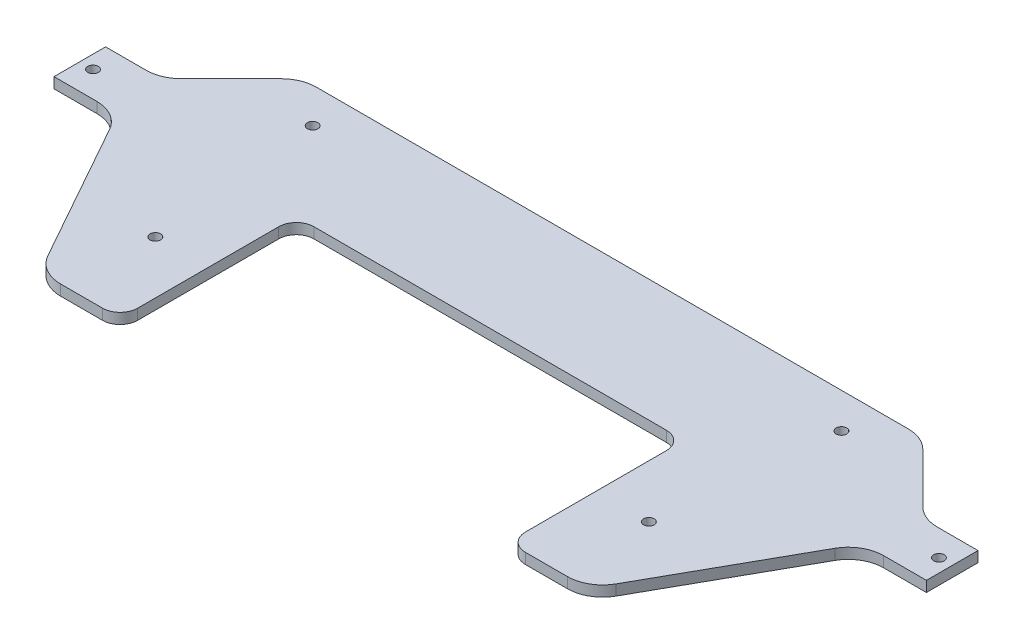
ISO-10303-21;
HEADER;
FILE_DESCRIPTION(('STEP AP214'),'2;1');
FILE_NAME('part.step','',(''),(''),'','','');
FILE_SCHEMA(('AUTOMOTIVE_DESIGN { 1 0 10303 214 1 1 1 1 }'));
ENDSEC;
DATA;
#1=APPLICATION_CONTEXT('core data for automotive mechanical design processes');
#2=APPLICATION_PROTOCOL_DEFINITION('international standard','automotive_design',2000,#1);
#3=PRODUCT_CONTEXT('',#1,'mechanical');
#4=PRODUCT('Part','Part','',(#3));
#5=PRODUCT_RELATED_PRODUCT_CATEGORY('part','',(#4));
#6=PRODUCT_DEFINITION_FORMATION('','',#4);
#7=PRODUCT_DEFINITION_CONTEXT('part definition',#1,'design');
#8=PRODUCT_DEFINITION('design','',#6,#7);
#9=PRODUCT_DEFINITION_SHAPE('','',#8);
#10=(LENGTH_UNIT() NAMED_UNIT(*) SI_UNIT(.MILLI.,.METRE.));
#11=(NAMED_UNIT(*) PLANE_ANGLE_UNIT() SI_UNIT($,.RADIAN.));
#12=(NAMED_UNIT(*) SI_UNIT($,.STERADIAN.) SOLID_ANGLE_UNIT());
#13=UNCERTAINTY_MEASURE_WITH_UNIT(LENGTH_MEASURE(1.E-05),#10,'distance_accuracy_value','');
#14=(GEOMETRIC_REPRESENTATION_CONTEXT(3) GLOBAL_UNCERTAINTY_ASSIGNED_CONTEXT((#13)) GLOBAL_UNIT_ASSIGNED_CONTEXT((#10,
#11,#12)) REPRESENTATION_CONTEXT('',''));
#15=CARTESIAN_POINT('',(0.,0.,0.));
#16=DIRECTION('',(0.,0.,1.));
#17=DIRECTION('',(1.,0.,0.));
#18=AXIS2_PLACEMENT_3D('',#15,#16,#17);
#19=CARTESIAN_POINT('',(-77.75,3.,42.3181711088205));
#20=DIRECTION('',(0.,0.,-1.));
#21=DIRECTION('',(-1.,0.,0.));
#22=AXIS2_PLACEMENT_3D('',#19,#20,#21);
#23=PLANE('',#22);
#24=DIRECTION('',(1.,0.,0.));
#25=VECTOR('',#24,1.);
#26=CARTESIAN_POINT('',(-77.75,0.,42.3181711088205));
#27=LINE('',#26,#25);
#28=CARTESIAN_POINT('',(-71.8887609744845,0.,42.3181711088205));
#29=VERTEX_POINT('',#28);
#30=CARTESIAN_POINT('',(-60.,0.,42.3181711088205));
#31=VERTEX_POINT('',#30);
#32=EDGE_CURVE('E253',#29,#31,#27,.T.);
#33=ORIENTED_EDGE('',*,*,#32,.T.);
#34=DIRECTION('',(0.,1.,0.));
#35=VECTOR('',#34,1.);
#36=CARTESIAN_POINT('',(-60.,3.,42.3181711088205));
#37=LINE('',#36,#35);
#38=CARTESIAN_POINT('',(-60.,3.,42.3181711088205));
#39=VERTEX_POINT('',#38);
#40=EDGE_CURVE('E347',#31,#39,#37,.T.);
#41=ORIENTED_EDGE('',*,*,#40,.T.);
#42=DIRECTION('',(1.,0.,0.));
#43=VECTOR('',#42,1.);
#44=CARTESIAN_POINT('',(-77.75,3.,42.3181711088205));
#45=LINE('',#44,#43);
#46=CARTESIAN_POINT('',(-71.8887609744845,3.,42.3181711088205));
#47=VERTEX_POINT('',#46);
#48=EDGE_CURVE('E460',#47,#39,#45,.T.);
#49=ORIENTED_EDGE('',*,*,#48,.F.);
#50=DIRECTION('',(0.,-1.,0.));
#51=VECTOR('',#50,1.);
#52=CARTESIAN_POINT('',(-71.8887609744845,3.,42.3181711088205));
#53=LINE('',#52,#51);
#54=EDGE_CURVE('E307',#47,#29,#53,.T.);
#55=ORIENTED_EDGE('',*,*,#54,.T.);
#56=EDGE_LOOP('',(#33,#41,#49,#55));
#57=FACE_BOUND('',#56,.T.);
#58=ADVANCED_FACE('F39',(#57),#23,.F.);
#59=CARTESIAN_POINT('',(-88.1,3.,-42.3181711088205));
#60=DIRECTION('',(0.707106781186547,0.,0.707106781186547));
#61=DIRECTION('',(0.707106781186548,0.,-0.707106781186548));
#62=AXIS2_PLACEMENT_3D('',#59,#60,#61);
#63=PLANE('',#62);
#64=DIRECTION('',(-0.707106781186548,0.,0.707106781186548));
#65=VECTOR('',#64,1.);
#66=CARTESIAN_POINT('',(-88.1,3.,-42.3181711088205));
#67=LINE('',#66,#65);
#68=CARTESIAN_POINT('',(-91.0289321881345,3.,-39.389238920686));
#69=VERTEX_POINT('',#68);
#70=CARTESIAN_POINT('',(-105.171067811865,3.,-25.247103296955));
#71=VERTEX_POINT('',#70);
#72=EDGE_CURVE('E270',#69,#71,#67,.T.);
#73=ORIENTED_EDGE('',*,*,#72,.F.);
#74=DIRECTION('',(0.,-1.,0.));
#75=VECTOR('',#74,1.);
#76=CARTESIAN_POINT('',(-91.0289321881345,3.,-39.389238920686));
#77=LINE('',#76,#75);
#78=CARTESIAN_POINT('',(-91.0289321881345,0.,-39.389238920686));
#79=VERTEX_POINT('',#78);
#80=EDGE_CURVE('E301',#69,#79,#77,.T.);
#81=ORIENTED_EDGE('',*,*,#80,.T.);
#82=DIRECTION('',(-0.707106781186548,0.,0.707106781186548));
#83=VECTOR('',#82,1.);
#84=CARTESIAN_POINT('',(-88.1,0.,-42.3181711088205));
#85=LINE('',#84,#83);
#86=CARTESIAN_POINT('',(-105.171067811865,0.,-25.247103296955));
#87=VERTEX_POINT('',#86);
#88=EDGE_CURVE('E249',#79,#87,#85,.T.);
#89=ORIENTED_EDGE('',*,*,#88,.T.);
#90=DIRECTION('',(0.,-1.,0.));
#91=VECTOR('',#90,1.);
#92=CARTESIAN_POINT('',(-105.171067811865,3.,-25.247103296955));
#93=LINE('',#92,#91);
#94=EDGE_CURVE('E299',#87,#71,#93,.F.);
#95=ORIENTED_EDGE('',*,*,#94,.T.);
#96=EDGE_LOOP('',(#73,#81,#89,#95));
#97=FACE_BOUND('',#96,.T.);
#98=ADVANCED_FACE('F480',(#97),#63,.F.);
#99=CARTESIAN_POINT('',(-108.1,3.,-22.3181711088205));
#100=DIRECTION('',(0.,0.,1.));
#101=DIRECTION('',(1.,0.,0.));
#102=AXIS2_PLACEMENT_3D('',#99,#100,#101);
#103=PLANE('',#102);
#104=DIRECTION('',(-1.,0.,0.));
#105=VECTOR('',#104,1.);
#106=CARTESIAN_POINT('',(-108.1,0.,-22.3181711088205));
#107=LINE('',#106,#105);
#108=CARTESIAN_POINT('',(-112.242135623731,0.,-22.3181711088205));
#109=VERTEX_POINT('',#108);
#110=CARTESIAN_POINT('',(-123.75,0.,-22.3181711088205));
#111=VERTEX_POINT('',#110);
#112=EDGE_CURVE('E244',#109,#111,#107,.T.);
#113=ORIENTED_EDGE('',*,*,#112,.T.);
#114=DIRECTION('',(0.,1.,0.));
#115=VECTOR('',#114,1.);
#116=CARTESIAN_POINT('',(-123.75,0.,-22.3181711088205));
#117=LINE('',#116,#115);
#118=CARTESIAN_POINT('',(-123.75,3.,-22.3181711088205));
#119=VERTEX_POINT('',#118);
#120=EDGE_CURVE('E62',#111,#119,#117,.T.);
#121=ORIENTED_EDGE('',*,*,#120,.T.);
#122=DIRECTION('',(-1.,0.,0.));
#123=VECTOR('',#122,1.);
#124=CARTESIAN_POINT('',(-108.1,3.,-22.3181711088205));
#125=LINE('',#124,#123);
#126=CARTESIAN_POINT('',(-112.242135623731,3.,-22.3181711088205));
#127=VERTEX_POINT('',#126);
#128=EDGE_CURVE('E452',#127,#119,#125,.T.);
#129=ORIENTED_EDGE('',*,*,#128,.F.);
#130=DIRECTION('',(0.,-1.,0.));
#131=VECTOR('',#130,1.);
#132=CARTESIAN_POINT('',(-112.242135623731,0.,-22.3181711088205));
#133=LINE('',#132,#131);
#134=EDGE_CURVE('E328',#127,#109,#133,.T.);
#135=ORIENTED_EDGE('',*,*,#134,.T.);
#136=EDGE_LOOP('',(#113,#121,#129,#135));
#137=FACE_BOUND('',#136,.T.);
#138=ADVANCED_FACE('F488',(#137),#103,.F.);
#139=CARTESIAN_POINT('',(-127.75,3.,-7.6818288911795));
#140=DIRECTION('',(0.,0.,-1.));
#141=DIRECTION('',(-1.,0.,0.));
#142=AXIS2_PLACEMENT_3D('',#139,#140,#141);
#143=PLANE('',#142);
#144=DIRECTION('',(1.,0.,0.));
#145=VECTOR('',#144,1.);
#146=CARTESIAN_POINT('',(-127.75,3.,-7.6818288911795));
#147=LINE('',#146,#145);
#148=CARTESIAN_POINT('',(-123.75,3.,-7.6818288911795));
#149=VERTEX_POINT('',#148);
#150=CARTESIAN_POINT('',(-111.611239025516,3.,-7.6818288911795));
#151=VERTEX_POINT('',#150);
#152=EDGE_CURVE('E237',#149,#151,#147,.T.);
#153=ORIENTED_EDGE('',*,*,#152,.F.);
#154=DIRECTION('',(0.,1.,0.));
#155=VECTOR('',#154,1.);
#156=CARTESIAN_POINT('',(-123.75,0.,-7.6818288911795));
#157=LINE('',#156,#155);
#158=CARTESIAN_POINT('',(-123.75,0.,-7.6818288911795));
#159=VERTEX_POINT('',#158);
#160=EDGE_CURVE('E223',#159,#149,#157,.T.);
#161=ORIENTED_EDGE('',*,*,#160,.F.);
#162=DIRECTION('',(1.,0.,0.));
#163=VECTOR('',#162,1.);
#164=CARTESIAN_POINT('',(-127.75,0.,-7.6818288911795));
#165=LINE('',#164,#163);
#166=CARTESIAN_POINT('',(-111.611239025516,0.,-7.6818288911795));
#167=VERTEX_POINT('',#166);
#168=EDGE_CURVE('E235',#159,#167,#165,.T.);
#169=ORIENTED_EDGE('',*,*,#168,.T.);
#170=DIRECTION('',(0.,-1.,0.));
#171=VECTOR('',#170,1.);
#172=CARTESIAN_POINT('',(-111.611239025516,3.,-7.6818288911795));
#173=LINE('',#172,#171);
#174=EDGE_CURVE('E326',#167,#151,#173,.F.);
#175=ORIENTED_EDGE('',*,*,#174,.T.);
#176=EDGE_LOOP('',(#153,#161,#169,#175));
#177=FACE_BOUND('',#176,.T.);
#178=ADVANCED_FACE('F233',(#177),#143,.F.);
#179=CARTESIAN_POINT('',(-105.75,3.,-7.6818288911795));
#180=DIRECTION('',(0.87250601594972,0.,-0.488603368931844));
#181=DIRECTION('',(-0.488603368931844,0.,-0.87250601594972));
#182=AXIS2_PLACEMENT_3D('',#179,#180,#181);
#183=PLANE('',#182);
#184=DIRECTION('',(0.488603368931844,0.,0.87250601594972));
#185=VECTOR('',#184,1.);
#186=CARTESIAN_POINT('',(-105.75,0.,-7.6818288911795));
#187=LINE('',#186,#185);
#188=CARTESIAN_POINT('',(-102.886178866018,0.,-2.56786258049794));
#189=VERTEX_POINT('',#188);
#190=CARTESIAN_POINT('',(-80.6138211339817,0.,37.2042047981389));
#191=VERTEX_POINT('',#190);
#192=EDGE_CURVE('E243',#189,#191,#187,.T.);
#193=ORIENTED_EDGE('',*,*,#192,.T.);
#194=DIRECTION('',(0.,-1.,0.));
#195=VECTOR('',#194,1.);
#196=CARTESIAN_POINT('',(-80.6138211339817,3.,37.2042047981389));
#197=LINE('',#196,#195);
#198=CARTESIAN_POINT('',(-80.6138211339817,3.,37.2042047981389));
#199=VERTEX_POINT('',#198);
#200=EDGE_CURVE('E313',#191,#199,#197,.F.);
#201=ORIENTED_EDGE('',*,*,#200,.T.);
#202=DIRECTION('',(0.488603368931844,0.,0.87250601594972));
#203=VECTOR('',#202,1.);
#204=CARTESIAN_POINT('',(-105.75,3.,-7.6818288911795));
#205=LINE('',#204,#203);
#206=CARTESIAN_POINT('',(-102.886178866018,3.,-2.56786258049794));
#207=VERTEX_POINT('',#206);
#208=EDGE_CURVE('E456',#207,#199,#205,.T.);
#209=ORIENTED_EDGE('',*,*,#208,.F.);
#210=DIRECTION('',(0.,-1.,0.));
#211=VECTOR('',#210,1.);
#212=CARTESIAN_POINT('',(-102.886178866018,0.,-2.56786258049794));
#213=LINE('',#212,#211);
#214=EDGE_CURVE('E310',#207,#189,#213,.T.);
#215=ORIENTED_EDGE('',*,*,#214,.T.);
#216=EDGE_LOOP('',(#193,#201,#209,#215));
#217=FACE_BOUND('',#216,.T.);
#218=ADVANCED_FACE('F584',(#217),#183,.F.);
#219=CARTESIAN_POINT('',(60.,3.,42.3181711088205));
#220=VERTEX_POINT('',#219);
#221=CARTESIAN_POINT('',(71.8887609744845,3.,42.3181711088205));
#222=VERTEX_POINT('',#221);
#223=EDGE_CURVE('E459',#220,#222,#45,.T.);
#224=ORIENTED_EDGE('',*,*,#223,.F.);
#225=DIRECTION('',(0.,1.,0.));
#226=VECTOR('',#225,1.);
#227=CARTESIAN_POINT('',(60.,3.,42.3181711088205));
#228=LINE('',#227,#226);
#229=CARTESIAN_POINT('',(60.,0.,42.3181711088205));
#230=VERTEX_POINT('',#229);
#231=EDGE_CURVE('E368',#220,#230,#228,.F.);
#232=ORIENTED_EDGE('',*,*,#231,.T.);
#233=CARTESIAN_POINT('',(71.8887609744845,0.,42.3181711088205));
#234=VERTEX_POINT('',#233);
#235=EDGE_CURVE('E247',#230,#234,#27,.T.);
#236=ORIENTED_EDGE('',*,*,#235,.T.);
#237=DIRECTION('',(0.,-1.,0.));
#238=VECTOR('',#237,1.);
#239=CARTESIAN_POINT('',(71.8887609744845,3.,42.3181711088205));
#240=LINE('',#239,#238);
#241=EDGE_CURVE('E304',#234,#222,#240,.F.);
#242=ORIENTED_EDGE('',*,*,#241,.T.);
#243=EDGE_LOOP('',(#224,#232,#236,#242));
#244=FACE_BOUND('',#243,.T.);
#245=ADVANCED_FACE('F515',(#244),#23,.F.);
#246=CARTESIAN_POINT('',(105.75,3.,-7.6818288911795));
#247=DIRECTION('',(-0.87250601594972,0.,-0.488603368931844));
#248=DIRECTION('',(-0.488603368931844,0.,0.87250601594972));
#249=AXIS2_PLACEMENT_3D('',#246,#247,#248);
#250=PLANE('',#249);
#251=DIRECTION('',(0.488603368931844,0.,-0.87250601594972));
#252=VECTOR('',#251,1.);
#253=CARTESIAN_POINT('',(105.75,3.,-7.6818288911795));
#254=LINE('',#253,#252);
#255=CARTESIAN_POINT('',(80.6138211339817,3.,37.2042047981389));
#256=VERTEX_POINT('',#255);
#257=CARTESIAN_POINT('',(102.886178866018,3.,-2.56786258049794));
#258=VERTEX_POINT('',#257);
#259=EDGE_CURVE('E463',#256,#258,#254,.T.);
#260=ORIENTED_EDGE('',*,*,#259,.F.);
#261=DIRECTION('',(0.,-1.,0.));
#262=VECTOR('',#261,1.);
#263=CARTESIAN_POINT('',(80.6138211339817,3.,37.2042047981389));
#264=LINE('',#263,#262);
#265=CARTESIAN_POINT('',(80.6138211339817,0.,37.2042047981389));
#266=VERTEX_POINT('',#265);
#267=EDGE_CURVE('E317',#256,#266,#264,.T.);
#268=ORIENTED_EDGE('',*,*,#267,.T.);
#269=DIRECTION('',(0.488603368931844,0.,-0.87250601594972));
#270=VECTOR('',#269,1.);
#271=CARTESIAN_POINT('',(105.75,0.,-7.6818288911795));
#272=LINE('',#271,#270);
#273=CARTESIAN_POINT('',(102.886178866018,0.,-2.56786258049794));
#274=VERTEX_POINT('',#273);
#275=EDGE_CURVE('E256',#266,#274,#272,.T.);
#276=ORIENTED_EDGE('',*,*,#275,.T.);
#277=DIRECTION('',(0.,-1.,0.));
#278=VECTOR('',#277,1.);
#279=CARTESIAN_POINT('',(102.886178866018,3.,-2.56786258049794));
#280=LINE('',#279,#278);
#281=EDGE_CURVE('E315',#274,#258,#280,.F.);
#282=ORIENTED_EDGE('',*,*,#281,.T.);
#283=EDGE_LOOP('',(#260,#268,#276,#282));
#284=FACE_BOUND('',#283,.T.);
#285=ADVANCED_FACE('F524',(#284),#250,.F.);
#286=CARTESIAN_POINT('',(127.75,3.,-7.6818288911795));
#287=DIRECTION('',(0.,0.,-1.));
#288=DIRECTION('',(-1.,0.,0.));
#289=AXIS2_PLACEMENT_3D('',#286,#287,#288);
#290=PLANE('',#289);
#291=DIRECTION('',(1.,0.,0.));
#292=VECTOR('',#291,1.);
#293=CARTESIAN_POINT('',(127.75,0.,-7.6818288911795));
#294=LINE('',#293,#292);
#295=CARTESIAN_POINT('',(111.611239025516,0.,-7.6818288911795));
#296=VERTEX_POINT('',#295);
#297=CARTESIAN_POINT('',(123.75,0.,-7.6818288911795));
#298=VERTEX_POINT('',#297);
#299=EDGE_CURVE('E259',#296,#298,#294,.T.);
#300=ORIENTED_EDGE('',*,*,#299,.T.);
#301=DIRECTION('',(0.,1.,0.));
#302=VECTOR('',#301,1.);
#303=CARTESIAN_POINT('',(123.75,0.,-7.6818288911795));
#304=LINE('',#303,#302);
#305=CARTESIAN_POINT('',(123.75,3.,-7.6818288911795));
#306=VERTEX_POINT('',#305);
#307=EDGE_CURVE('E54',#298,#306,#304,.T.);
#308=ORIENTED_EDGE('',*,*,#307,.T.);
#309=DIRECTION('',(1.,0.,0.));
#310=VECTOR('',#309,1.);
#311=CARTESIAN_POINT('',(127.75,3.,-7.6818288911795));
#312=LINE('',#311,#310);
#313=CARTESIAN_POINT('',(111.611239025516,3.,-7.6818288911795));
#314=VERTEX_POINT('',#313);
#315=EDGE_CURVE('E466',#314,#306,#312,.T.);
#316=ORIENTED_EDGE('',*,*,#315,.F.);
#317=DIRECTION('',(0.,-1.,0.));
#318=VECTOR('',#317,1.);
#319=CARTESIAN_POINT('',(111.611239025516,0.,-7.6818288911795));
#320=LINE('',#319,#318);
#321=EDGE_CURVE('E323',#314,#296,#320,.T.);
#322=ORIENTED_EDGE('',*,*,#321,.T.);
#323=EDGE_LOOP('',(#300,#308,#316,#322));
#324=FACE_BOUND('',#323,.T.);
#325=ADVANCED_FACE('F533',(#324),#290,.F.);
#326=CARTESIAN_POINT('',(108.1,3.,-22.3181711088205));
#327=DIRECTION('',(0.,0.,1.));
#328=DIRECTION('',(1.,0.,0.));
#329=AXIS2_PLACEMENT_3D('',#326,#327,#328);
#330=PLANE('',#329);
#331=DIRECTION('',(-1.,0.,0.));
#332=VECTOR('',#331,1.);
#333=CARTESIAN_POINT('',(108.1,3.,-22.3181711088205));
#334=LINE('',#333,#332);
#335=CARTESIAN_POINT('',(123.75,3.,-22.3181711088205));
#336=VERTEX_POINT('',#335);
#337=CARTESIAN_POINT('',(112.242135623731,3.,-22.3181711088205));
#338=VERTEX_POINT('',#337);
#339=EDGE_CURVE('E469',#336,#338,#334,.T.);
#340=ORIENTED_EDGE('',*,*,#339,.F.);
#341=DIRECTION('',(0.,1.,0.));
#342=VECTOR('',#341,1.);
#343=CARTESIAN_POINT('',(123.75,0.,-22.3181711088205));
#344=LINE('',#343,#342);
#345=CARTESIAN_POINT('',(123.75,0.,-22.3181711088205));
#346=VERTEX_POINT('',#345);
#347=EDGE_CURVE('E492',#346,#336,#344,.T.);
#348=ORIENTED_EDGE('',*,*,#347,.F.);
#349=DIRECTION('',(-1.,0.,0.));
#350=VECTOR('',#349,1.);
#351=CARTESIAN_POINT('',(108.1,0.,-22.3181711088205));
#352=LINE('',#351,#350);
#353=CARTESIAN_POINT('',(112.242135623731,0.,-22.3181711088205));
#354=VERTEX_POINT('',#353);
#355=EDGE_CURVE('E262',#346,#354,#352,.T.);
#356=ORIENTED_EDGE('',*,*,#355,.T.);
#357=DIRECTION('',(0.,-1.,0.));
#358=VECTOR('',#357,1.);
#359=CARTESIAN_POINT('',(112.242135623731,3.,-22.3181711088205));
#360=LINE('',#359,#358);
#361=EDGE_CURVE('E320',#354,#338,#360,.F.);
#362=ORIENTED_EDGE('',*,*,#361,.T.);
#363=EDGE_LOOP('',(#340,#348,#356,#362));
#364=FACE_BOUND('',#363,.T.);
#365=ADVANCED_FACE('F540',(#364),#330,.F.);
#366=CARTESIAN_POINT('',(88.1,3.,-42.3181711088205));
#367=DIRECTION('',(-0.707106781186547,0.,0.707106781186547));
#368=DIRECTION('',(0.707106781186548,0.,0.707106781186548));
#369=AXIS2_PLACEMENT_3D('',#366,#367,#368);
#370=PLANE('',#369);
#371=DIRECTION('',(-0.707106781186548,0.,-0.707106781186548));
#372=VECTOR('',#371,1.);
#373=CARTESIAN_POINT('',(88.1,0.,-42.3181711088205));
#374=LINE('',#373,#372);
#375=CARTESIAN_POINT('',(105.171067811865,0.,-25.247103296955));
#376=VERTEX_POINT('',#375);
#377=CARTESIAN_POINT('',(91.0289321881345,0.,-39.389238920686));
#378=VERTEX_POINT('',#377);
#379=EDGE_CURVE('E264',#376,#378,#374,.T.);
#380=ORIENTED_EDGE('',*,*,#379,.T.);
#381=DIRECTION('',(0.,-1.,0.));
#382=VECTOR('',#381,1.);
#383=CARTESIAN_POINT('',(91.0289321881345,3.,-39.389238920686));
#384=LINE('',#383,#382);
#385=CARTESIAN_POINT('',(91.0289321881345,3.,-39.389238920686));
#386=VERTEX_POINT('',#385);
#387=EDGE_CURVE('E289',#378,#386,#384,.F.);
#388=ORIENTED_EDGE('',*,*,#387,.T.);
#389=DIRECTION('',(-0.707106781186548,0.,-0.707106781186548));
#390=VECTOR('',#389,1.);
#391=CARTESIAN_POINT('',(88.1,3.,-42.3181711088205));
#392=LINE('',#391,#390);
#393=CARTESIAN_POINT('',(105.171067811865,3.,-25.247103296955));
#394=VERTEX_POINT('',#393);
#395=EDGE_CURVE('E471',#394,#386,#392,.T.);
#396=ORIENTED_EDGE('',*,*,#395,.F.);
#397=DIRECTION('',(0.,-1.,0.));
#398=VECTOR('',#397,1.);
#399=CARTESIAN_POINT('',(105.171067811865,0.,-25.247103296955));
#400=LINE('',#399,#398);
#401=EDGE_CURVE('E286',#394,#376,#400,.T.);
#402=ORIENTED_EDGE('',*,*,#401,.T.);
#403=EDGE_LOOP('',(#380,#388,#396,#402));
#404=FACE_BOUND('',#403,.T.);
#405=ADVANCED_FACE('F548',(#404),#370,.F.);
#406=CARTESIAN_POINT('',(-88.1,3.,-42.3181711088205));
#407=DIRECTION('',(0.,0.,1.));
#408=DIRECTION('',(1.,0.,0.));
#409=AXIS2_PLACEMENT_3D('',#406,#407,#408);
#410=PLANE('',#409);
#411=DIRECTION('',(-1.,0.,0.));
#412=VECTOR('',#411,1.);
#413=CARTESIAN_POINT('',(-88.1,3.,-42.3181711088205));
#414=LINE('',#413,#412);
#415=CARTESIAN_POINT('',(83.9578643762691,3.,-42.3181711088205));
#416=VERTEX_POINT('',#415);
#417=CARTESIAN_POINT('',(-83.9578643762691,3.,-42.3181711088205));
#418=VERTEX_POINT('',#417);
#419=EDGE_CURVE('E274',#416,#418,#414,.T.);
#420=ORIENTED_EDGE('',*,*,#419,.F.);
#421=DIRECTION('',(0.,-1.,0.));
#422=VECTOR('',#421,1.);
#423=CARTESIAN_POINT('',(83.9578643762691,3.,-42.3181711088205));
#424=LINE('',#423,#422);
#425=CARTESIAN_POINT('',(83.9578643762691,0.,-42.3181711088205));
#426=VERTEX_POINT('',#425);
#427=EDGE_CURVE('E273',#416,#426,#424,.T.);
#428=ORIENTED_EDGE('',*,*,#427,.T.);
#429=DIRECTION('',(-1.,0.,0.));
#430=VECTOR('',#429,1.);
#431=CARTESIAN_POINT('',(-88.1,0.,-42.3181711088205));
#432=LINE('',#431,#430);
#433=CARTESIAN_POINT('',(-83.9578643762691,0.,-42.3181711088205));
#434=VERTEX_POINT('',#433);
#435=EDGE_CURVE('E267',#426,#434,#432,.T.);
#436=ORIENTED_EDGE('',*,*,#435,.T.);
#437=DIRECTION('',(0.,-1.,0.));
#438=VECTOR('',#437,1.);
#439=CARTESIAN_POINT('',(-83.9578643762691,3.,-42.3181711088205));
#440=LINE('',#439,#438);
#441=EDGE_CURVE('E271',#434,#418,#440,.F.);
#442=ORIENTED_EDGE('',*,*,#441,.T.);
#443=EDGE_LOOP('',(#420,#428,#436,#442));
#444=FACE_BOUND('',#443,.T.);
#445=ADVANCED_FACE('F559',(#444),#410,.F.);
#446=CARTESIAN_POINT('',(0.,3.,0.));
#447=DIRECTION('',(0.,1.,0.));
#448=DIRECTION('',(0.,0.,1.));
#449=AXIS2_PLACEMENT_3D('',#446,#447,#448);
#450=PLANE('',#449);
#451=DIRECTION('',(0.,0.,-1.));
#452=VECTOR('',#451,1.);
#453=CARTESIAN_POINT('',(-123.75,3.,-7.6818288911795));
#454=LINE('',#453,#452);
#455=EDGE_CURVE('E229',#149,#119,#454,.T.);
#456=ORIENTED_EDGE('',*,*,#455,.F.);
#457=ORIENTED_EDGE('',*,*,#152,.T.);
#458=CARTESIAN_POINT('',(-111.611239025516,3.,2.3181711088205));
#459=DIRECTION('',(0.,1.,0.));
#460=DIRECTION('',(0.,0.,1.));
#461=AXIS2_PLACEMENT_3D('',#458,#459,#460);
#462=CIRCLE('',#461,10.);
#463=EDGE_CURVE('E341',#151,#207,#462,.F.);
#464=ORIENTED_EDGE('',*,*,#463,.T.);
#465=ORIENTED_EDGE('',*,*,#208,.T.);
#466=CARTESIAN_POINT('',(-71.8887609744845,3.,32.3181711088205));
#467=DIRECTION('',(0.,1.,0.));
#468=DIRECTION('',(0.,0.,1.));
#469=AXIS2_PLACEMENT_3D('',#466,#467,#468);
#470=CIRCLE('',#469,10.);
#471=EDGE_CURVE('E293',#199,#47,#470,.T.);
#472=ORIENTED_EDGE('',*,*,#471,.T.);
#473=ORIENTED_EDGE('',*,*,#48,.T.);
#474=CARTESIAN_POINT('',(-60.,3.,37.3181711088205));
#475=DIRECTION('',(0.,1.,0.));
#476=DIRECTION('',(0.,0.,1.));
#477=AXIS2_PLACEMENT_3D('',#474,#475,#476);
#478=CIRCLE('',#477,5.);
#479=CARTESIAN_POINT('',(-55.,3.,37.3181711088205));
#480=VERTEX_POINT('',#479);
#481=EDGE_CURVE('E352',#39,#480,#478,.T.);
#482=ORIENTED_EDGE('',*,*,#481,.T.);
#483=DIRECTION('',(0.,0.,1.));
#484=VECTOR('',#483,1.);
#485=CARTESIAN_POINT('',(-55.,3.,42.3181711088205));
#486=LINE('',#485,#484);
#487=CARTESIAN_POINT('',(-55.,3.,-2.68182889117948));
#488=VERTEX_POINT('',#487);
#489=EDGE_CURVE('E386',#488,#480,#486,.T.);
#490=ORIENTED_EDGE('',*,*,#489,.F.);
#491=CARTESIAN_POINT('',(-50.,3.,-2.68182889117948));
#492=DIRECTION('',(0.,1.,0.));
#493=DIRECTION('',(0.,0.,1.));
#494=AXIS2_PLACEMENT_3D('',#491,#492,#493);
#495=CIRCLE('',#494,5.);
#496=CARTESIAN_POINT('',(-50.,3.,-7.68182889117949));
#497=VERTEX_POINT('',#496);
#498=EDGE_CURVE('E47',#488,#497,#495,.F.);
#499=ORIENTED_EDGE('',*,*,#498,.T.);
#500=DIRECTION('',(-1.,0.,0.));
#501=VECTOR('',#500,1.);
#502=CARTESIAN_POINT('',(-55.,3.,-7.68182889117949));
#503=LINE('',#502,#501);
#504=CARTESIAN_POINT('',(50.,3.,-7.68182889117949));
#505=VERTEX_POINT('',#504);
#506=EDGE_CURVE('E384',#505,#497,#503,.T.);
#507=ORIENTED_EDGE('',*,*,#506,.F.);
#508=CARTESIAN_POINT('',(50.,3.,-2.68182889117949));
#509=DIRECTION('',(0.,1.,0.));
#510=DIRECTION('',(0.,0.,1.));
#511=AXIS2_PLACEMENT_3D('',#508,#509,#510);
#512=CIRCLE('',#511,5.);
#513=CARTESIAN_POINT('',(55.,3.,-2.68182889117949));
#514=VERTEX_POINT('',#513);
#515=EDGE_CURVE('E375',#505,#514,#512,.F.);
#516=ORIENTED_EDGE('',*,*,#515,.T.);
#517=DIRECTION('',(0.,0.,-1.));
#518=VECTOR('',#517,1.);
#519=CARTESIAN_POINT('',(55.,3.,-7.68182889117949));
#520=LINE('',#519,#518);
#521=CARTESIAN_POINT('',(55.,3.,37.3181711088205));
#522=VERTEX_POINT('',#521);
#523=EDGE_CURVE('E395',#522,#514,#520,.T.);
#524=ORIENTED_EDGE('',*,*,#523,.F.);
#525=CARTESIAN_POINT('',(60.,3.,37.3181711088205));
#526=DIRECTION('',(0.,1.,0.));
#527=DIRECTION('',(0.,0.,1.));
#528=AXIS2_PLACEMENT_3D('',#525,#526,#527);
#529=CIRCLE('',#528,5.);
#530=EDGE_CURVE('E350',#522,#220,#529,.T.);
#531=ORIENTED_EDGE('',*,*,#530,.T.);
#532=ORIENTED_EDGE('',*,*,#223,.T.);
#533=CARTESIAN_POINT('',(71.8887609744845,3.,32.3181711088205));
#534=DIRECTION('',(0.,1.,0.));
#535=DIRECTION('',(0.,0.,1.));
#536=AXIS2_PLACEMENT_3D('',#533,#534,#535);
#537=CIRCLE('',#536,10.);
#538=EDGE_CURVE('E291',#222,#256,#537,.T.);
#539=ORIENTED_EDGE('',*,*,#538,.T.);
#540=ORIENTED_EDGE('',*,*,#259,.T.);
#541=CARTESIAN_POINT('',(111.611239025516,3.,2.3181711088205));
#542=DIRECTION('',(0.,1.,0.));
#543=DIRECTION('',(0.,0.,1.));
#544=AXIS2_PLACEMENT_3D('',#541,#542,#543);
#545=CIRCLE('',#544,10.);
#546=EDGE_CURVE('E338',#258,#314,#545,.F.);
#547=ORIENTED_EDGE('',*,*,#546,.T.);
#548=ORIENTED_EDGE('',*,*,#315,.T.);
#549=DIRECTION('',(0.,0.,1.));
#550=VECTOR('',#549,1.);
#551=CARTESIAN_POINT('',(123.75,3.,-7.6818288911795));
#552=LINE('',#551,#550);
#553=EDGE_CURVE('E496',#336,#306,#552,.T.);
#554=ORIENTED_EDGE('',*,*,#553,.F.);
#555=ORIENTED_EDGE('',*,*,#339,.T.);
#556=CARTESIAN_POINT('',(112.242135623731,3.,-32.3181711088205));
#557=DIRECTION('',(0.,1.,0.));
#558=DIRECTION('',(0.,0.,1.));
#559=AXIS2_PLACEMENT_3D('',#556,#557,#558);
#560=CIRCLE('',#559,10.);
#561=EDGE_CURVE('E334',#338,#394,#560,.F.);
#562=ORIENTED_EDGE('',*,*,#561,.T.);
#563=ORIENTED_EDGE('',*,*,#395,.T.);
#564=CARTESIAN_POINT('',(83.9578643762691,3.,-32.3181711088205));
#565=DIRECTION('',(0.,1.,0.));
#566=DIRECTION('',(0.,0.,1.));
#567=AXIS2_PLACEMENT_3D('',#564,#565,#566);
#568=CIRCLE('',#567,10.);
#569=EDGE_CURVE('E297',#386,#416,#568,.T.);
#570=ORIENTED_EDGE('',*,*,#569,.T.);
#571=ORIENTED_EDGE('',*,*,#419,.T.);
#572=CARTESIAN_POINT('',(-83.9578643762691,3.,-32.3181711088205));
#573=DIRECTION('',(0.,1.,0.));
#574=DIRECTION('',(0.,0.,1.));
#575=AXIS2_PLACEMENT_3D('',#572,#573,#574);
#576=CIRCLE('',#575,10.);
#577=EDGE_CURVE('E295',#418,#69,#576,.T.);
#578=ORIENTED_EDGE('',*,*,#577,.T.);
#579=ORIENTED_EDGE('',*,*,#72,.T.);
#580=CARTESIAN_POINT('',(-112.242135623731,3.,-32.3181711088205));
#581=DIRECTION('',(0.,1.,0.));
#582=DIRECTION('',(0.,0.,1.));
#583=AXIS2_PLACEMENT_3D('',#580,#581,#582);
#584=CIRCLE('',#583,10.);
#585=EDGE_CURVE('E345',#71,#127,#584,.F.);
#586=ORIENTED_EDGE('',*,*,#585,.T.);
#587=ORIENTED_EDGE('',*,*,#128,.T.);
#588=EDGE_LOOP('',(#456,#457,#464,#465,#472,#473,#482,#490,#499,#507,#516,#524,#531,#532,#539,
#540,#547,#548,#554,#555,#562,#563,#570,#571,#578,#579,#586,#587));
#589=FACE_BOUND('',#588,.T.);
#590=CARTESIAN_POINT('',(75.,3.,-32.3181711088205));
#591=DIRECTION('',(0.,1.,0.));
#592=DIRECTION('',(0.,0.,1.));
#593=AXIS2_PLACEMENT_3D('',#590,#591,#592);
#594=CIRCLE('',#593,1.5);
#595=CARTESIAN_POINT('',(75.,3.,-30.8181711088205));
#596=VERTEX_POINT('',#595);
#597=EDGE_CURVE('E409',#596,#596,#594,.T.);
#598=ORIENTED_EDGE('',*,*,#597,.F.);
#599=EDGE_LOOP('',(#598));
#600=FACE_BOUND('',#599,.T.);
#601=CARTESIAN_POINT('',(-70.,3.,17.3181711088205));
#602=DIRECTION('',(0.,1.,0.));
#603=DIRECTION('',(0.,0.,1.));
#604=AXIS2_PLACEMENT_3D('',#601,#602,#603);
#605=CIRCLE('',#604,1.5);
#606=CARTESIAN_POINT('',(-70.,3.,18.8181711088205));
#607=VERTEX_POINT('',#606);
#608=EDGE_CURVE('E433',#607,#607,#605,.T.);
#609=ORIENTED_EDGE('',*,*,#608,.F.);
#610=EDGE_LOOP('',(#609));
#611=FACE_BOUND('',#610,.T.);
#612=CARTESIAN_POINT('',(-119.996067811865,3.,-15.));
#613=DIRECTION('',(0.,1.,0.));
#614=DIRECTION('',(0.,0.,1.));
#615=AXIS2_PLACEMENT_3D('',#612,#613,#614);
#616=CIRCLE('',#615,1.5);
#617=CARTESIAN_POINT('',(-119.996067811865,3.,-13.5));
#618=VERTEX_POINT('',#617);
#619=EDGE_CURVE('E440',#618,#618,#616,.T.);
#620=ORIENTED_EDGE('',*,*,#619,.F.);
#621=EDGE_LOOP('',(#620));
#622=FACE_BOUND('',#621,.T.);
#623=CARTESIAN_POINT('',(119.996067811865,3.,-15.));
#624=DIRECTION('',(0.,1.,0.));
#625=DIRECTION('',(0.,0.,1.));
#626=AXIS2_PLACEMENT_3D('',#623,#624,#625);
#627=CIRCLE('',#626,1.5);
#628=CARTESIAN_POINT('',(119.996067811865,3.,-13.5));
#629=VERTEX_POINT('',#628);
#630=EDGE_CURVE('E421',#629,#629,#627,.T.);
#631=ORIENTED_EDGE('',*,*,#630,.F.);
#632=EDGE_LOOP('',(#631));
#633=FACE_BOUND('',#632,.T.);
#634=CARTESIAN_POINT('',(-75.,3.,-32.3181711088205));
#635=DIRECTION('',(0.,1.,0.));
#636=DIRECTION('',(0.,0.,1.));
#637=AXIS2_PLACEMENT_3D('',#634,#635,#636);
#638=CIRCLE('',#637,1.5);
#639=CARTESIAN_POINT('',(-75.,3.,-30.8181711088205));
#640=VERTEX_POINT('',#639);
#641=EDGE_CURVE('E428',#640,#640,#638,.T.);
#642=ORIENTED_EDGE('',*,*,#641,.F.);
#643=EDGE_LOOP('',(#642));
#644=FACE_BOUND('',#643,.T.);
#645=CARTESIAN_POINT('',(70.,3.,17.3181711088205));
#646=DIRECTION('',(0.,1.,0.));
#647=DIRECTION('',(0.,0.,1.));
#648=AXIS2_PLACEMENT_3D('',#645,#646,#647);
#649=CIRCLE('',#648,1.5);
#650=CARTESIAN_POINT('',(70.,3.,18.8181711088205));
#651=VERTEX_POINT('',#650);
#652=EDGE_CURVE('E436',#651,#651,#649,.T.);
#653=ORIENTED_EDGE('',*,*,#652,.F.);
#654=EDGE_LOOP('',(#653));
#655=FACE_BOUND('',#654,.T.);
#656=ADVANCED_FACE('F382',(#589,#600,#611,#622,#633,#644,#655),#450,.T.);
#657=CARTESIAN_POINT('',(0.,0.,0.));
#658=DIRECTION('',(0.,1.,0.));
#659=DIRECTION('',(0.,0.,1.));
#660=AXIS2_PLACEMENT_3D('',#657,#658,#659);
#661=PLANE('',#660);
#662=CARTESIAN_POINT('',(75.,0.,-32.3181711088205));
#663=DIRECTION('',(0.,1.,0.));
#664=DIRECTION('',(0.,0.,1.));
#665=AXIS2_PLACEMENT_3D('',#662,#663,#664);
#666=CIRCLE('',#665,1.5);
#667=CARTESIAN_POINT('',(75.,0.,-30.8181711088205));
#668=VERTEX_POINT('',#667);
#669=EDGE_CURVE('E406',#668,#668,#666,.T.);
#670=ORIENTED_EDGE('',*,*,#669,.T.);
#671=EDGE_LOOP('',(#670));
#672=FACE_BOUND('',#671,.T.);
#673=CARTESIAN_POINT('',(-70.,0.,17.3181711088205));
#674=DIRECTION('',(0.,1.,0.));
#675=DIRECTION('',(0.,0.,1.));
#676=AXIS2_PLACEMENT_3D('',#673,#674,#675);
#677=CIRCLE('',#676,1.5);
#678=CARTESIAN_POINT('',(-70.,0.,18.8181711088205));
#679=VERTEX_POINT('',#678);
#680=EDGE_CURVE('E437',#679,#679,#677,.T.);
#681=ORIENTED_EDGE('',*,*,#680,.T.);
#682=EDGE_LOOP('',(#681));
#683=FACE_BOUND('',#682,.T.);
#684=CARTESIAN_POINT('',(-119.996067811865,0.,-15.));
#685=DIRECTION('',(0.,1.,0.));
#686=DIRECTION('',(0.,0.,1.));
#687=AXIS2_PLACEMENT_3D('',#684,#685,#686);
#688=CIRCLE('',#687,1.5);
#689=CARTESIAN_POINT('',(-119.996067811865,0.,-13.5));
#690=VERTEX_POINT('',#689);
#691=EDGE_CURVE('E424',#690,#690,#688,.T.);
#692=ORIENTED_EDGE('',*,*,#691,.T.);
#693=EDGE_LOOP('',(#692));
#694=FACE_BOUND('',#693,.T.);
#695=CARTESIAN_POINT('',(119.996067811865,0.,-15.));
#696=DIRECTION('',(0.,1.,0.));
#697=DIRECTION('',(0.,0.,1.));
#698=AXIS2_PLACEMENT_3D('',#695,#696,#697);
#699=CIRCLE('',#698,1.5);
#700=CARTESIAN_POINT('',(119.996067811865,0.,-13.5));
#701=VERTEX_POINT('',#700);
#702=EDGE_CURVE('E425',#701,#701,#699,.T.);
#703=ORIENTED_EDGE('',*,*,#702,.T.);
#704=EDGE_LOOP('',(#703));
#705=FACE_BOUND('',#704,.T.);
#706=CARTESIAN_POINT('',(-75.,0.,-32.3181711088205));
#707=DIRECTION('',(0.,1.,0.));
#708=DIRECTION('',(0.,0.,1.));
#709=AXIS2_PLACEMENT_3D('',#706,#707,#708);
#710=CIRCLE('',#709,1.5);
#711=CARTESIAN_POINT('',(-75.,0.,-30.8181711088205));
#712=VERTEX_POINT('',#711);
#713=EDGE_CURVE('E419',#712,#712,#710,.T.);
#714=ORIENTED_EDGE('',*,*,#713,.T.);
#715=EDGE_LOOP('',(#714));
#716=FACE_BOUND('',#715,.T.);
#717=CARTESIAN_POINT('',(70.,0.,17.3181711088205));
#718=DIRECTION('',(0.,1.,0.));
#719=DIRECTION('',(0.,0.,1.));
#720=AXIS2_PLACEMENT_3D('',#717,#718,#719);
#721=CIRCLE('',#720,1.5);
#722=CARTESIAN_POINT('',(70.,0.,18.8181711088205));
#723=VERTEX_POINT('',#722);
#724=EDGE_CURVE('E445',#723,#723,#721,.T.);
#725=ORIENTED_EDGE('',*,*,#724,.T.);
#726=EDGE_LOOP('',(#725));
#727=FACE_BOUND('',#726,.T.);
#728=ORIENTED_EDGE('',*,*,#168,.F.);
#729=DIRECTION('',(0.,0.,-1.));
#730=VECTOR('',#729,1.);
#731=CARTESIAN_POINT('',(-123.75,0.,-7.6818288911795));
#732=LINE('',#731,#730);
#733=EDGE_CURVE('E220',#159,#111,#732,.T.);
#734=ORIENTED_EDGE('',*,*,#733,.T.);
#735=ORIENTED_EDGE('',*,*,#112,.F.);
#736=CARTESIAN_POINT('',(-112.242135623731,0.,-32.3181711088205));
#737=DIRECTION('',(0.,1.,0.));
#738=DIRECTION('',(0.,0.,1.));
#739=AXIS2_PLACEMENT_3D('',#736,#737,#738);
#740=CIRCLE('',#739,10.);
#741=EDGE_CURVE('E343',#109,#87,#740,.T.);
#742=ORIENTED_EDGE('',*,*,#741,.T.);
#743=ORIENTED_EDGE('',*,*,#88,.F.);
#744=CARTESIAN_POINT('',(-83.9578643762691,0.,-32.3181711088205));
#745=DIRECTION('',(0.,1.,0.));
#746=DIRECTION('',(0.,0.,1.));
#747=AXIS2_PLACEMENT_3D('',#744,#745,#746);
#748=CIRCLE('',#747,10.);
#749=EDGE_CURVE('E282',#79,#434,#748,.F.);
#750=ORIENTED_EDGE('',*,*,#749,.T.);
#751=ORIENTED_EDGE('',*,*,#435,.F.);
#752=CARTESIAN_POINT('',(83.9578643762691,0.,-32.3181711088205));
#753=DIRECTION('',(0.,1.,0.));
#754=DIRECTION('',(0.,0.,1.));
#755=AXIS2_PLACEMENT_3D('',#752,#753,#754);
#756=CIRCLE('',#755,10.);
#757=EDGE_CURVE('E284',#426,#378,#756,.F.);
#758=ORIENTED_EDGE('',*,*,#757,.T.);
#759=ORIENTED_EDGE('',*,*,#379,.F.);
#760=CARTESIAN_POINT('',(112.242135623731,0.,-32.3181711088205));
#761=DIRECTION('',(0.,1.,0.));
#762=DIRECTION('',(0.,0.,1.));
#763=AXIS2_PLACEMENT_3D('',#760,#761,#762);
#764=CIRCLE('',#763,10.);
#765=EDGE_CURVE('E331',#376,#354,#764,.T.);
#766=ORIENTED_EDGE('',*,*,#765,.T.);
#767=ORIENTED_EDGE('',*,*,#355,.F.);
#768=DIRECTION('',(0.,0.,1.));
#769=VECTOR('',#768,1.);
#770=CARTESIAN_POINT('',(123.75,0.,-7.6818288911795));
#771=LINE('',#770,#769);
#772=EDGE_CURVE('E494',#346,#298,#771,.T.);
#773=ORIENTED_EDGE('',*,*,#772,.T.);
#774=ORIENTED_EDGE('',*,*,#299,.F.);
#775=CARTESIAN_POINT('',(111.611239025516,0.,2.3181711088205));
#776=DIRECTION('',(0.,1.,0.));
#777=DIRECTION('',(0.,0.,1.));
#778=AXIS2_PLACEMENT_3D('',#775,#776,#777);
#779=CIRCLE('',#778,10.);
#780=EDGE_CURVE('E336',#296,#274,#779,.T.);
#781=ORIENTED_EDGE('',*,*,#780,.T.);
#782=ORIENTED_EDGE('',*,*,#275,.F.);
#783=CARTESIAN_POINT('',(71.8887609744845,0.,32.3181711088205));
#784=DIRECTION('',(0.,1.,0.));
#785=DIRECTION('',(0.,0.,1.));
#786=AXIS2_PLACEMENT_3D('',#783,#784,#785);
#787=CIRCLE('',#786,10.);
#788=EDGE_CURVE('E277',#266,#234,#787,.F.);
#789=ORIENTED_EDGE('',*,*,#788,.T.);
#790=ORIENTED_EDGE('',*,*,#235,.F.);
#791=CARTESIAN_POINT('',(60.,0.,37.3181711088205));
#792=DIRECTION('',(0.,1.,0.));
#793=DIRECTION('',(0.,0.,1.));
#794=AXIS2_PLACEMENT_3D('',#791,#792,#793);
#795=CIRCLE('',#794,5.);
#796=CARTESIAN_POINT('',(55.,0.,37.3181711088205));
#797=VERTEX_POINT('',#796);
#798=EDGE_CURVE('E359',#230,#797,#795,.F.);
#799=ORIENTED_EDGE('',*,*,#798,.T.);
#800=DIRECTION('',(0.,0.,-1.));
#801=VECTOR('',#800,1.);
#802=CARTESIAN_POINT('',(55.,0.,-7.68182889117949));
#803=LINE('',#802,#801);
#804=CARTESIAN_POINT('',(55.,0.,-2.68182889117949));
#805=VERTEX_POINT('',#804);
#806=EDGE_CURVE('E411',#797,#805,#803,.T.);
#807=ORIENTED_EDGE('',*,*,#806,.T.);
#808=CARTESIAN_POINT('',(50.,0.,-2.68182889117949));
#809=DIRECTION('',(0.,1.,0.));
#810=DIRECTION('',(0.,0.,1.));
#811=AXIS2_PLACEMENT_3D('',#808,#809,#810);
#812=CIRCLE('',#811,5.);
#813=CARTESIAN_POINT('',(50.,0.,-7.68182889117949));
#814=VERTEX_POINT('',#813);
#815=EDGE_CURVE('E377',#805,#814,#812,.T.);
#816=ORIENTED_EDGE('',*,*,#815,.T.);
#817=DIRECTION('',(-1.,0.,0.));
#818=VECTOR('',#817,1.);
#819=CARTESIAN_POINT('',(-55.,0.,-7.68182889117949));
#820=LINE('',#819,#818);
#821=CARTESIAN_POINT('',(-50.,0.,-7.68182889117949));
#822=VERTEX_POINT('',#821);
#823=EDGE_CURVE('E402',#814,#822,#820,.T.);
#824=ORIENTED_EDGE('',*,*,#823,.T.);
#825=CARTESIAN_POINT('',(-50.,0.,-2.68182889117948));
#826=DIRECTION('',(0.,1.,0.));
#827=DIRECTION('',(0.,0.,1.));
#828=AXIS2_PLACEMENT_3D('',#825,#826,#827);
#829=CIRCLE('',#828,5.);
#830=CARTESIAN_POINT('',(-55.,0.,-2.68182889117948));
#831=VERTEX_POINT('',#830);
#832=EDGE_CURVE('E11',#822,#831,#829,.T.);
#833=ORIENTED_EDGE('',*,*,#832,.T.);
#834=DIRECTION('',(0.,0.,1.));
#835=VECTOR('',#834,1.);
#836=CARTESIAN_POINT('',(-55.,0.,42.3181711088205));
#837=LINE('',#836,#835);
#838=CARTESIAN_POINT('',(-55.,0.,37.3181711088205));
#839=VERTEX_POINT('',#838);
#840=EDGE_CURVE('E400',#831,#839,#837,.T.);
#841=ORIENTED_EDGE('',*,*,#840,.T.);
#842=CARTESIAN_POINT('',(-60.,0.,37.3181711088205));
#843=DIRECTION('',(0.,1.,0.));
#844=DIRECTION('',(0.,0.,1.));
#845=AXIS2_PLACEMENT_3D('',#842,#843,#844);
#846=CIRCLE('',#845,5.);
#847=EDGE_CURVE('E361',#839,#31,#846,.F.);
#848=ORIENTED_EDGE('',*,*,#847,.T.);
#849=ORIENTED_EDGE('',*,*,#32,.F.);
#850=CARTESIAN_POINT('',(-71.8887609744845,0.,32.3181711088205));
#851=DIRECTION('',(0.,1.,0.));
#852=DIRECTION('',(0.,0.,1.));
#853=AXIS2_PLACEMENT_3D('',#850,#851,#852);
#854=CIRCLE('',#853,10.);
#855=EDGE_CURVE('E280',#29,#191,#854,.F.);
#856=ORIENTED_EDGE('',*,*,#855,.T.);
#857=ORIENTED_EDGE('',*,*,#192,.F.);
#858=CARTESIAN_POINT('',(-111.611239025516,0.,2.3181711088205));
#859=DIRECTION('',(0.,1.,0.));
#860=DIRECTION('',(0.,0.,1.));
#861=AXIS2_PLACEMENT_3D('',#858,#859,#860);
#862=CIRCLE('',#861,10.);
#863=EDGE_CURVE('E241',#189,#167,#862,.T.);
#864=ORIENTED_EDGE('',*,*,#863,.T.);
#865=EDGE_LOOP('',(#728,#734,#735,#742,#743,#750,#751,#758,#759,#766,#767,#773,#774,#781,#782,
#789,#790,#799,#807,#816,#824,#833,#841,#848,#849,#856,#857,#864));
#866=FACE_BOUND('',#865,.T.);
#867=ADVANCED_FACE('F239',(#672,#683,#694,#705,#716,#727,#866),#661,.F.);
#868=CARTESIAN_POINT('',(83.9578643762691,3.,-32.3181711088205));
#869=DIRECTION('',(0.,-1.,0.));
#870=DIRECTION('',(0.,0.,-1.));
#871=AXIS2_PLACEMENT_3D('',#868,#869,#870);
#872=CYLINDRICAL_SURFACE('',#871,10.);
#873=ORIENTED_EDGE('',*,*,#569,.F.);
#874=ORIENTED_EDGE('',*,*,#387,.F.);
#875=ORIENTED_EDGE('',*,*,#757,.F.);
#876=ORIENTED_EDGE('',*,*,#427,.F.);
#877=EDGE_LOOP('',(#873,#874,#875,#876));
#878=FACE_BOUND('',#877,.T.);
#879=ADVANCED_FACE('F554',(#878),#872,.T.);
#880=CARTESIAN_POINT('',(-83.9578643762691,3.,-32.3181711088205));
#881=DIRECTION('',(0.,-1.,0.));
#882=DIRECTION('',(0.,0.,-1.));
#883=AXIS2_PLACEMENT_3D('',#880,#881,#882);
#884=CYLINDRICAL_SURFACE('',#883,10.);
#885=ORIENTED_EDGE('',*,*,#577,.F.);
#886=ORIENTED_EDGE('',*,*,#441,.F.);
#887=ORIENTED_EDGE('',*,*,#749,.F.);
#888=ORIENTED_EDGE('',*,*,#80,.F.);
#889=EDGE_LOOP('',(#885,#886,#887,#888));
#890=FACE_BOUND('',#889,.T.);
#891=ADVANCED_FACE('F562',(#890),#884,.T.);
#892=CARTESIAN_POINT('',(-71.8887609744845,3.,32.3181711088205));
#893=DIRECTION('',(0.,-1.,0.));
#894=DIRECTION('',(0.,0.,-1.));
#895=AXIS2_PLACEMENT_3D('',#892,#893,#894);
#896=CYLINDRICAL_SURFACE('',#895,10.);
#897=ORIENTED_EDGE('',*,*,#471,.F.);
#898=ORIENTED_EDGE('',*,*,#200,.F.);
#899=ORIENTED_EDGE('',*,*,#855,.F.);
#900=ORIENTED_EDGE('',*,*,#54,.F.);
#901=EDGE_LOOP('',(#897,#898,#899,#900));
#902=FACE_BOUND('',#901,.T.);
#903=ADVANCED_FACE('F564',(#902),#896,.T.);
#904=CARTESIAN_POINT('',(71.8887609744845,3.,32.3181711088205));
#905=DIRECTION('',(0.,-1.,0.));
#906=DIRECTION('',(0.,0.,-1.));
#907=AXIS2_PLACEMENT_3D('',#904,#905,#906);
#908=CYLINDRICAL_SURFACE('',#907,10.);
#909=ORIENTED_EDGE('',*,*,#538,.F.);
#910=ORIENTED_EDGE('',*,*,#241,.F.);
#911=ORIENTED_EDGE('',*,*,#788,.F.);
#912=ORIENTED_EDGE('',*,*,#267,.F.);
#913=EDGE_LOOP('',(#909,#910,#911,#912));
#914=FACE_BOUND('',#913,.T.);
#915=ADVANCED_FACE('F520',(#914),#908,.T.);
#916=CARTESIAN_POINT('',(112.242135623731,3.,-32.3181711088205));
#917=DIRECTION('',(0.,1.,0.));
#918=DIRECTION('',(0.,0.,1.));
#919=AXIS2_PLACEMENT_3D('',#916,#917,#918);
#920=CYLINDRICAL_SURFACE('',#919,10.);
#921=ORIENTED_EDGE('',*,*,#561,.F.);
#922=ORIENTED_EDGE('',*,*,#361,.F.);
#923=ORIENTED_EDGE('',*,*,#765,.F.);
#924=ORIENTED_EDGE('',*,*,#401,.F.);
#925=EDGE_LOOP('',(#921,#922,#923,#924));
#926=FACE_BOUND('',#925,.T.);
#927=ADVANCED_FACE('F551',(#926),#920,.F.);
#928=CARTESIAN_POINT('',(111.611239025516,3.,2.3181711088205));
#929=DIRECTION('',(0.,1.,0.));
#930=DIRECTION('',(0.,0.,1.));
#931=AXIS2_PLACEMENT_3D('',#928,#929,#930);
#932=CYLINDRICAL_SURFACE('',#931,10.);
#933=ORIENTED_EDGE('',*,*,#546,.F.);
#934=ORIENTED_EDGE('',*,*,#281,.F.);
#935=ORIENTED_EDGE('',*,*,#780,.F.);
#936=ORIENTED_EDGE('',*,*,#321,.F.);
#937=EDGE_LOOP('',(#933,#934,#935,#936));
#938=FACE_BOUND('',#937,.T.);
#939=ADVANCED_FACE('F528',(#938),#932,.F.);
#940=CARTESIAN_POINT('',(-111.611239025516,3.,2.3181711088205));
#941=DIRECTION('',(0.,1.,0.));
#942=DIRECTION('',(0.,0.,1.));
#943=AXIS2_PLACEMENT_3D('',#940,#941,#942);
#944=CYLINDRICAL_SURFACE('',#943,10.);
#945=ORIENTED_EDGE('',*,*,#463,.F.);
#946=ORIENTED_EDGE('',*,*,#174,.F.);
#947=ORIENTED_EDGE('',*,*,#863,.F.);
#948=ORIENTED_EDGE('',*,*,#214,.F.);
#949=EDGE_LOOP('',(#945,#946,#947,#948));
#950=FACE_BOUND('',#949,.T.);
#951=ADVANCED_FACE('F768',(#950),#944,.F.);
#952=CARTESIAN_POINT('',(-112.242135623731,3.,-32.3181711088205));
#953=DIRECTION('',(0.,1.,0.));
#954=DIRECTION('',(0.,0.,1.));
#955=AXIS2_PLACEMENT_3D('',#952,#953,#954);
#956=CYLINDRICAL_SURFACE('',#955,10.);
#957=ORIENTED_EDGE('',*,*,#585,.F.);
#958=ORIENTED_EDGE('',*,*,#94,.F.);
#959=ORIENTED_EDGE('',*,*,#741,.F.);
#960=ORIENTED_EDGE('',*,*,#134,.F.);
#961=EDGE_LOOP('',(#957,#958,#959,#960));
#962=FACE_BOUND('',#961,.T.);
#963=ADVANCED_FACE('F484',(#962),#956,.F.);
#964=CARTESIAN_POINT('',(70.,0.,17.3181711088205));
#965=DIRECTION('',(0.,1.,0.));
#966=DIRECTION('',(0.,0.,1.));
#967=AXIS2_PLACEMENT_3D('',#964,#965,#966);
#968=CYLINDRICAL_SURFACE('',#967,1.5);
#969=ORIENTED_EDGE('',*,*,#724,.F.);
#970=EDGE_LOOP('',(#969));
#971=FACE_BOUND('',#970,.T.);
#972=ORIENTED_EDGE('',*,*,#652,.T.);
#973=EDGE_LOOP('',(#972));
#974=FACE_BOUND('',#973,.T.);
#975=ADVANCED_FACE('F751',(#971,#974),#968,.F.);
#976=CARTESIAN_POINT('',(-75.,0.,-32.3181711088205));
#977=DIRECTION('',(0.,1.,0.));
#978=DIRECTION('',(0.,0.,1.));
#979=AXIS2_PLACEMENT_3D('',#976,#977,#978);
#980=CYLINDRICAL_SURFACE('',#979,1.5);
#981=ORIENTED_EDGE('',*,*,#713,.F.);
#982=EDGE_LOOP('',(#981));
#983=FACE_BOUND('',#982,.T.);
#984=ORIENTED_EDGE('',*,*,#641,.T.);
#985=EDGE_LOOP('',(#984));
#986=FACE_BOUND('',#985,.T.);
#987=ADVANCED_FACE('F742',(#983,#986),#980,.F.);
#988=CARTESIAN_POINT('',(119.996067811865,0.,-15.));
#989=DIRECTION('',(0.,1.,0.));
#990=DIRECTION('',(0.,0.,1.));
#991=AXIS2_PLACEMENT_3D('',#988,#989,#990);
#992=CYLINDRICAL_SURFACE('',#991,1.5);
#993=ORIENTED_EDGE('',*,*,#702,.F.);
#994=EDGE_LOOP('',(#993));
#995=FACE_BOUND('',#994,.T.);
#996=ORIENTED_EDGE('',*,*,#630,.T.);
#997=EDGE_LOOP('',(#996));
#998=FACE_BOUND('',#997,.T.);
#999=ADVANCED_FACE('F733',(#995,#998),#992,.F.);
#1000=CARTESIAN_POINT('',(-119.996067811865,0.,-15.));
#1001=DIRECTION('',(0.,1.,0.));
#1002=DIRECTION('',(0.,0.,1.));
#1003=AXIS2_PLACEMENT_3D('',#1000,#1001,#1002);
#1004=CYLINDRICAL_SURFACE('',#1003,1.5);
#1005=ORIENTED_EDGE('',*,*,#691,.F.);
#1006=EDGE_LOOP('',(#1005));
#1007=FACE_BOUND('',#1006,.T.);
#1008=ORIENTED_EDGE('',*,*,#619,.T.);
#1009=EDGE_LOOP('',(#1008));
#1010=FACE_BOUND('',#1009,.T.);
#1011=ADVANCED_FACE('F724',(#1007,#1010),#1004,.F.);
#1012=CARTESIAN_POINT('',(-70.,0.,17.3181711088205));
#1013=DIRECTION('',(0.,1.,0.));
#1014=DIRECTION('',(0.,0.,1.));
#1015=AXIS2_PLACEMENT_3D('',#1012,#1013,#1014);
#1016=CYLINDRICAL_SURFACE('',#1015,1.5);
#1017=ORIENTED_EDGE('',*,*,#680,.F.);
#1018=EDGE_LOOP('',(#1017));
#1019=FACE_BOUND('',#1018,.T.);
#1020=ORIENTED_EDGE('',*,*,#608,.T.);
#1021=EDGE_LOOP('',(#1020));
#1022=FACE_BOUND('',#1021,.T.);
#1023=ADVANCED_FACE('F715',(#1019,#1022),#1016,.F.);
#1024=CARTESIAN_POINT('',(75.,0.,-32.3181711088205));
#1025=DIRECTION('',(0.,1.,0.));
#1026=DIRECTION('',(0.,0.,1.));
#1027=AXIS2_PLACEMENT_3D('',#1024,#1025,#1026);
#1028=CYLINDRICAL_SURFACE('',#1027,1.5);
#1029=ORIENTED_EDGE('',*,*,#669,.F.);
#1030=EDGE_LOOP('',(#1029));
#1031=FACE_BOUND('',#1030,.T.);
#1032=ORIENTED_EDGE('',*,*,#597,.T.);
#1033=EDGE_LOOP('',(#1032));
#1034=FACE_BOUND('',#1033,.T.);
#1035=ADVANCED_FACE('F703',(#1031,#1034),#1028,.F.);
#1036=CARTESIAN_POINT('',(-55.,0.,42.3181711088205));
#1037=DIRECTION('',(-1.,0.,0.));
#1038=DIRECTION('',(0.,0.,1.));
#1039=AXIS2_PLACEMENT_3D('',#1036,#1037,#1038);
#1040=PLANE('',#1039);
#1041=ORIENTED_EDGE('',*,*,#489,.T.);
#1042=DIRECTION('',(0.,1.,0.));
#1043=VECTOR('',#1042,1.);
#1044=CARTESIAN_POINT('',(-55.,0.,37.3181711088205));
#1045=LINE('',#1044,#1043);
#1046=EDGE_CURVE('E357',#480,#839,#1045,.F.);
#1047=ORIENTED_EDGE('',*,*,#1046,.T.);
#1048=ORIENTED_EDGE('',*,*,#840,.F.);
#1049=DIRECTION('',(0.,1.,0.));
#1050=VECTOR('',#1049,1.);
#1051=CARTESIAN_POINT('',(-55.,3.,-2.68182889117948));
#1052=LINE('',#1051,#1050);
#1053=EDGE_CURVE('E354',#831,#488,#1052,.T.);
#1054=ORIENTED_EDGE('',*,*,#1053,.T.);
#1055=EDGE_LOOP('',(#1041,#1047,#1048,#1054));
#1056=FACE_BOUND('',#1055,.T.);
#1057=ADVANCED_FACE('F404',(#1056),#1040,.F.);
#1058=CARTESIAN_POINT('',(-55.,0.,-7.68182889117949));
#1059=DIRECTION('',(0.,0.,-1.));
#1060=DIRECTION('',(-1.,0.,0.));
#1061=AXIS2_PLACEMENT_3D('',#1058,#1059,#1060);
#1062=PLANE('',#1061);
#1063=ORIENTED_EDGE('',*,*,#823,.F.);
#1064=DIRECTION('',(0.,1.,0.));
#1065=VECTOR('',#1064,1.);
#1066=CARTESIAN_POINT('',(50.,3.,-7.68182889117949));
#1067=LINE('',#1066,#1065);
#1068=EDGE_CURVE('E372',#814,#505,#1067,.T.);
#1069=ORIENTED_EDGE('',*,*,#1068,.T.);
#1070=ORIENTED_EDGE('',*,*,#506,.T.);
#1071=DIRECTION('',(0.,1.,0.));
#1072=VECTOR('',#1071,1.);
#1073=CARTESIAN_POINT('',(-50.,0.,-7.68182889117949));
#1074=LINE('',#1073,#1072);
#1075=EDGE_CURVE('E370',#497,#822,#1074,.F.);
#1076=ORIENTED_EDGE('',*,*,#1075,.T.);
#1077=EDGE_LOOP('',(#1063,#1069,#1070,#1076));
#1078=FACE_BOUND('',#1077,.T.);
#1079=ADVANCED_FACE('F392',(#1078),#1062,.F.);
#1080=CARTESIAN_POINT('',(55.,0.,-7.68182889117949));
#1081=DIRECTION('',(1.,0.,0.));
#1082=DIRECTION('',(0.,0.,-1.));
#1083=AXIS2_PLACEMENT_3D('',#1080,#1081,#1082);
#1084=PLANE('',#1083);
#1085=ORIENTED_EDGE('',*,*,#806,.F.);
#1086=DIRECTION('',(0.,1.,0.));
#1087=VECTOR('',#1086,1.);
#1088=CARTESIAN_POINT('',(55.,0.,37.3181711088205));
#1089=LINE('',#1088,#1087);
#1090=EDGE_CURVE('E365',#797,#522,#1089,.T.);
#1091=ORIENTED_EDGE('',*,*,#1090,.T.);
#1092=ORIENTED_EDGE('',*,*,#523,.T.);
#1093=DIRECTION('',(0.,1.,0.));
#1094=VECTOR('',#1093,1.);
#1095=CARTESIAN_POINT('',(55.,0.,-2.68182889117949));
#1096=LINE('',#1095,#1094);
#1097=EDGE_CURVE('E363',#514,#805,#1096,.F.);
#1098=ORIENTED_EDGE('',*,*,#1097,.T.);
#1099=EDGE_LOOP('',(#1085,#1091,#1092,#1098));
#1100=FACE_BOUND('',#1099,.T.);
#1101=ADVANCED_FACE('F509',(#1100),#1084,.F.);
#1102=CARTESIAN_POINT('',(-60.,3.,37.3181711088205));
#1103=DIRECTION('',(0.,1.,0.));
#1104=DIRECTION('',(0.,0.,1.));
#1105=AXIS2_PLACEMENT_3D('',#1102,#1103,#1104);
#1106=CYLINDRICAL_SURFACE('',#1105,5.);
#1107=ORIENTED_EDGE('',*,*,#847,.F.);
#1108=ORIENTED_EDGE('',*,*,#1046,.F.);
#1109=ORIENTED_EDGE('',*,*,#481,.F.);
#1110=ORIENTED_EDGE('',*,*,#40,.F.);
#1111=EDGE_LOOP('',(#1107,#1108,#1109,#1110));
#1112=FACE_BOUND('',#1111,.T.);
#1113=ADVANCED_FACE('F675',(#1112),#1106,.T.);
#1114=CARTESIAN_POINT('',(60.,0.,37.3181711088205));
#1115=DIRECTION('',(0.,1.,0.));
#1116=DIRECTION('',(0.,0.,1.));
#1117=AXIS2_PLACEMENT_3D('',#1114,#1115,#1116);
#1118=CYLINDRICAL_SURFACE('',#1117,5.);
#1119=ORIENTED_EDGE('',*,*,#798,.F.);
#1120=ORIENTED_EDGE('',*,*,#231,.F.);
#1121=ORIENTED_EDGE('',*,*,#530,.F.);
#1122=ORIENTED_EDGE('',*,*,#1090,.F.);
#1123=EDGE_LOOP('',(#1119,#1120,#1121,#1122));
#1124=FACE_BOUND('',#1123,.T.);
#1125=ADVANCED_FACE('F511',(#1124),#1118,.T.);
#1126=CARTESIAN_POINT('',(50.,0.,-2.68182889117949));
#1127=DIRECTION('',(0.,-1.,0.));
#1128=DIRECTION('',(0.,0.,-1.));
#1129=AXIS2_PLACEMENT_3D('',#1126,#1127,#1128);
#1130=CYLINDRICAL_SURFACE('',#1129,5.);
#1131=ORIENTED_EDGE('',*,*,#815,.F.);
#1132=ORIENTED_EDGE('',*,*,#1097,.F.);
#1133=ORIENTED_EDGE('',*,*,#515,.F.);
#1134=ORIENTED_EDGE('',*,*,#1068,.F.);
#1135=EDGE_LOOP('',(#1131,#1132,#1133,#1134));
#1136=FACE_BOUND('',#1135,.T.);
#1137=ADVANCED_FACE('F507',(#1136),#1130,.F.);
#1138=CARTESIAN_POINT('',(-50.,0.,-2.68182889117948));
#1139=DIRECTION('',(0.,-1.,0.));
#1140=DIRECTION('',(0.,0.,-1.));
#1141=AXIS2_PLACEMENT_3D('',#1138,#1139,#1140);
#1142=CYLINDRICAL_SURFACE('',#1141,5.);
#1143=ORIENTED_EDGE('',*,*,#832,.F.);
#1144=ORIENTED_EDGE('',*,*,#1075,.F.);
#1145=ORIENTED_EDGE('',*,*,#498,.F.);
#1146=ORIENTED_EDGE('',*,*,#1053,.F.);
#1147=EDGE_LOOP('',(#1143,#1144,#1145,#1146));
#1148=FACE_BOUND('',#1147,.T.);
#1149=ADVANCED_FACE('F41',(#1148),#1142,.F.);
#1150=CARTESIAN_POINT('',(123.75,0.,-7.6818288911795));
#1151=DIRECTION('',(-1.,0.,0.));
#1152=DIRECTION('',(0.,0.,1.));
#1153=AXIS2_PLACEMENT_3D('',#1150,#1151,#1152);
#1154=PLANE('',#1153);
#1155=ORIENTED_EDGE('',*,*,#553,.T.);
#1156=ORIENTED_EDGE('',*,*,#307,.F.);
#1157=ORIENTED_EDGE('',*,*,#772,.F.);
#1158=ORIENTED_EDGE('',*,*,#347,.T.);
#1159=EDGE_LOOP('',(#1155,#1156,#1157,#1158));
#1160=FACE_BOUND('',#1159,.T.);
#1161=ADVANCED_FACE('F537',(#1160),#1154,.F.);
#1162=CARTESIAN_POINT('',(-123.75,0.,-7.6818288911795));
#1163=DIRECTION('',(1.,0.,0.));
#1164=DIRECTION('',(0.,0.,-1.));
#1165=AXIS2_PLACEMENT_3D('',#1162,#1163,#1164);
#1166=PLANE('',#1165);
#1167=ORIENTED_EDGE('',*,*,#455,.T.);
#1168=ORIENTED_EDGE('',*,*,#120,.F.);
#1169=ORIENTED_EDGE('',*,*,#733,.F.);
#1170=ORIENTED_EDGE('',*,*,#160,.T.);
#1171=EDGE_LOOP('',(#1167,#1168,#1169,#1170));
#1172=FACE_BOUND('',#1171,.T.);
#1173=ADVANCED_FACE('F222',(#1172),#1166,.F.);
#1174=CLOSED_SHELL('',(#58,#98,#138,#178,#218,#245,#285,#325,#365,#405,#445,#656,#867,#879,#891,
#903,#915,#927,#939,#951,#963,#975,#987,#999,#1011,#1023,#1035,#1057,#1079,#1101,#1113,#1125,
#1137,#1149,#1161,#1173));
#1175=MANIFOLD_SOLID_BREP('B2',#1174);
#1176=ADVANCED_BREP_SHAPE_REPRESENTATION('',(#18,#1175),#14);
#1177=SHAPE_DEFINITION_REPRESENTATION(#9,#1176);
ENDSEC;
END-ISO-10303-21;
